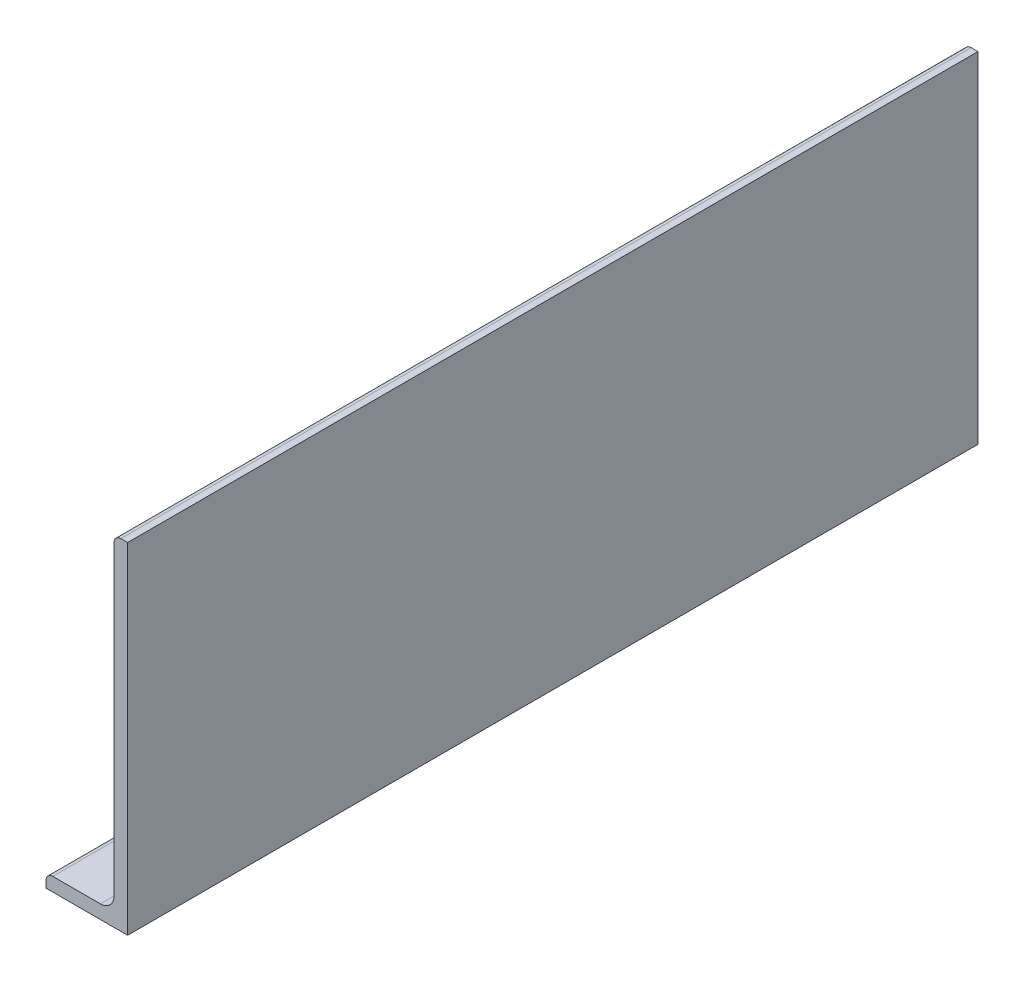
ISO-10303-21;
HEADER;
FILE_DESCRIPTION(('STEP AP214'),'2;1');
FILE_NAME('part.step','',(''),(''),'','','');
FILE_SCHEMA(('AUTOMOTIVE_DESIGN { 1 0 10303 214 1 1 1 1 }'));
ENDSEC;
DATA;
#1=APPLICATION_CONTEXT('core data for automotive mechanical design processes');
#2=APPLICATION_PROTOCOL_DEFINITION('international standard','automotive_design',2000,#1);
#3=PRODUCT_CONTEXT('',#1,'mechanical');
#4=PRODUCT('Part','Part','',(#3));
#5=PRODUCT_RELATED_PRODUCT_CATEGORY('part','',(#4));
#6=PRODUCT_DEFINITION_FORMATION('','',#4);
#7=PRODUCT_DEFINITION_CONTEXT('part definition',#1,'design');
#8=PRODUCT_DEFINITION('design','',#6,#7);
#9=PRODUCT_DEFINITION_SHAPE('','',#8);
#10=(LENGTH_UNIT() NAMED_UNIT(*) SI_UNIT(.MILLI.,.METRE.));
#11=(NAMED_UNIT(*) PLANE_ANGLE_UNIT() SI_UNIT($,.RADIAN.));
#12=(NAMED_UNIT(*) SI_UNIT($,.STERADIAN.) SOLID_ANGLE_UNIT());
#13=UNCERTAINTY_MEASURE_WITH_UNIT(LENGTH_MEASURE(1.E-05),#10,'distance_accuracy_value','');
#14=(GEOMETRIC_REPRESENTATION_CONTEXT(3) GLOBAL_UNCERTAINTY_ASSIGNED_CONTEXT((#13)) GLOBAL_UNIT_ASSIGNED_CONTEXT((#10,
#11,#12)) REPRESENTATION_CONTEXT('',''));
#15=CARTESIAN_POINT('',(0.,0.,0.));
#16=DIRECTION('',(0.,0.,1.));
#17=DIRECTION('',(1.,0.,0.));
#18=AXIS2_PLACEMENT_3D('',#15,#16,#17);
#19=CARTESIAN_POINT('',(324.671950076369,-19.4191739142864,125.));
#20=DIRECTION('',(0.,-1.,0.));
#21=DIRECTION('',(0.,0.,-1.));
#22=AXIS2_PLACEMENT_3D('',#19,#20,#21);
#23=PLANE('',#22);
#24=DIRECTION('',(-1.,0.,0.));
#25=VECTOR('',#24,1.);
#26=CARTESIAN_POINT('',(324.671950076369,-19.4191739142864,0.));
#27=LINE('',#26,#25);
#28=CARTESIAN_POINT('',(326.671950076369,-19.4191739142864,0.));
#29=VERTEX_POINT('',#28);
#30=CARTESIAN_POINT('',(325.671950076369,-19.4191739142864,0.));
#31=VERTEX_POINT('',#30);
#32=EDGE_CURVE('E135',#29,#31,#27,.T.);
#33=ORIENTED_EDGE('',*,*,#32,.T.);
#34=DIRECTION('',(0.,0.,-1.));
#35=VECTOR('',#34,1.);
#36=CARTESIAN_POINT('',(325.671950076369,-19.4191739142864,125.));
#37=LINE('',#36,#35);
#38=CARTESIAN_POINT('',(325.671950076369,-19.4191739142864,125.));
#39=VERTEX_POINT('',#38);
#40=EDGE_CURVE('E167',#31,#39,#37,.F.);
#41=ORIENTED_EDGE('',*,*,#40,.T.);
#42=DIRECTION('',(-1.,0.,0.));
#43=VECTOR('',#42,1.);
#44=CARTESIAN_POINT('',(324.671950076369,-19.4191739142864,125.));
#45=LINE('',#44,#43);
#46=CARTESIAN_POINT('',(326.671950076369,-19.4191739142864,125.));
#47=VERTEX_POINT('',#46);
#48=EDGE_CURVE('E148',#47,#39,#45,.T.);
#49=ORIENTED_EDGE('',*,*,#48,.F.);
#50=DIRECTION('',(0.,0.,-1.));
#51=VECTOR('',#50,1.);
#52=CARTESIAN_POINT('',(326.671950076369,-19.4191739142864,125.));
#53=LINE('',#52,#51);
#54=EDGE_CURVE('E131',#47,#29,#53,.T.);
#55=ORIENTED_EDGE('',*,*,#54,.T.);
#56=EDGE_LOOP('',(#33,#41,#49,#55));
#57=FACE_BOUND('',#56,.T.);
#58=ADVANCED_FACE('F33',(#57),#23,.F.);
#59=CARTESIAN_POINT('',(324.671950076369,-67.4191739142864,125.));
#60=DIRECTION('',(1.,0.,0.));
#61=DIRECTION('',(0.,0.,-1.));
#62=AXIS2_PLACEMENT_3D('',#59,#60,#61);
#63=PLANE('',#62);
#64=DIRECTION('',(0.,-1.,0.));
#65=VECTOR('',#64,1.);
#66=CARTESIAN_POINT('',(324.671950076369,-67.4191739142864,0.));
#67=LINE('',#66,#65);
#68=CARTESIAN_POINT('',(324.671950076369,-20.4191739142864,0.));
#69=VERTEX_POINT('',#68);
#70=CARTESIAN_POINT('',(324.671950076369,-65.4191739142864,0.));
#71=VERTEX_POINT('',#70);
#72=EDGE_CURVE('E138',#69,#71,#67,.T.);
#73=ORIENTED_EDGE('',*,*,#72,.T.);
#74=DIRECTION('',(0.,0.,-1.));
#75=VECTOR('',#74,1.);
#76=CARTESIAN_POINT('',(324.671950076369,-65.4191739142864,125.));
#77=LINE('',#76,#75);
#78=CARTESIAN_POINT('',(324.671950076369,-65.4191739142864,125.));
#79=VERTEX_POINT('',#78);
#80=EDGE_CURVE('E54',#71,#79,#77,.F.);
#81=ORIENTED_EDGE('',*,*,#80,.T.);
#82=DIRECTION('',(0.,-1.,0.));
#83=VECTOR('',#82,1.);
#84=CARTESIAN_POINT('',(324.671950076369,-67.4191739142864,125.));
#85=LINE('',#84,#83);
#86=CARTESIAN_POINT('',(324.671950076369,-20.4191739142864,125.));
#87=VERTEX_POINT('',#86);
#88=EDGE_CURVE('E240',#87,#79,#85,.T.);
#89=ORIENTED_EDGE('',*,*,#88,.F.);
#90=DIRECTION('',(0.,0.,-1.));
#91=VECTOR('',#90,1.);
#92=CARTESIAN_POINT('',(324.671950076369,-20.4191739142864,125.));
#93=LINE('',#92,#91);
#94=EDGE_CURVE('E164',#87,#69,#93,.T.);
#95=ORIENTED_EDGE('',*,*,#94,.T.);
#96=EDGE_LOOP('',(#73,#81,#89,#95));
#97=FACE_BOUND('',#96,.T.);
#98=ADVANCED_FACE('F193',(#97),#63,.F.);
#99=CARTESIAN_POINT('',(314.671950076369,-67.4191739142864,125.));
#100=DIRECTION('',(0.,-1.,0.));
#101=DIRECTION('',(0.,0.,-1.));
#102=AXIS2_PLACEMENT_3D('',#99,#100,#101);
#103=PLANE('',#102);
#104=CARTESIAN_POINT('',(319.171950076369,-67.4191739142864,105.));
#105=DIRECTION('',(0.,1.,0.));
#106=DIRECTION('',(0.,0.,1.));
#107=AXIS2_PLACEMENT_3D('',#104,#105,#106);
#108=CIRCLE('',#107,1.59999999999997);
#109=CARTESIAN_POINT('',(319.171950076369,-67.4191739142864,106.6));
#110=VERTEX_POINT('',#109);
#111=EDGE_CURVE('E228',#110,#110,#108,.T.);
#112=ORIENTED_EDGE('',*,*,#111,.F.);
#113=EDGE_LOOP('',(#112));
#114=FACE_BOUND('',#113,.T.);
#115=CARTESIAN_POINT('',(319.171950076369,-67.4191739142864,20.));
#116=DIRECTION('',(0.,1.,0.));
#117=DIRECTION('',(0.,0.,1.));
#118=AXIS2_PLACEMENT_3D('',#115,#116,#117);
#119=CIRCLE('',#118,1.59999999999996);
#120=CARTESIAN_POINT('',(319.171950076369,-67.4191739142864,21.6));
#121=VERTEX_POINT('',#120);
#122=EDGE_CURVE('E233',#121,#121,#119,.T.);
#123=ORIENTED_EDGE('',*,*,#122,.F.);
#124=EDGE_LOOP('',(#123));
#125=FACE_BOUND('',#124,.T.);
#126=DIRECTION('',(-1.,0.,0.));
#127=VECTOR('',#126,1.);
#128=CARTESIAN_POINT('',(314.671950076369,-67.4191739142864,125.));
#129=LINE('',#128,#127);
#130=CARTESIAN_POINT('',(322.671950076369,-67.4191739142864,125.));
#131=VERTEX_POINT('',#130);
#132=CARTESIAN_POINT('',(315.671950076369,-67.4191739142864,125.));
#133=VERTEX_POINT('',#132);
#134=EDGE_CURVE('E114',#131,#133,#129,.T.);
#135=ORIENTED_EDGE('',*,*,#134,.F.);
#136=DIRECTION('',(0.,0.,-1.));
#137=VECTOR('',#136,1.);
#138=CARTESIAN_POINT('',(322.671950076369,-67.4191739142864,0.));
#139=LINE('',#138,#137);
#140=CARTESIAN_POINT('',(322.671950076369,-67.4191739142864,0.));
#141=VERTEX_POINT('',#140);
#142=EDGE_CURVE('E169',#131,#141,#139,.T.);
#143=ORIENTED_EDGE('',*,*,#142,.T.);
#144=DIRECTION('',(-1.,0.,0.));
#145=VECTOR('',#144,1.);
#146=CARTESIAN_POINT('',(314.671950076369,-67.4191739142864,0.));
#147=LINE('',#146,#145);
#148=CARTESIAN_POINT('',(315.671950076369,-67.4191739142864,0.));
#149=VERTEX_POINT('',#148);
#150=EDGE_CURVE('E141',#141,#149,#147,.T.);
#151=ORIENTED_EDGE('',*,*,#150,.T.);
#152=DIRECTION('',(0.,0.,-1.));
#153=VECTOR('',#152,1.);
#154=CARTESIAN_POINT('',(315.671950076369,-67.4191739142864,125.));
#155=LINE('',#154,#153);
#156=EDGE_CURVE('E158',#149,#133,#155,.F.);
#157=ORIENTED_EDGE('',*,*,#156,.T.);
#158=EDGE_LOOP('',(#135,#143,#151,#157));
#159=FACE_BOUND('',#158,.T.);
#160=ADVANCED_FACE('F175',(#114,#125,#159),#103,.F.);
#161=CARTESIAN_POINT('',(314.671950076369,-69.4191739142864,125.));
#162=DIRECTION('',(1.,0.,0.));
#163=DIRECTION('',(0.,0.,-1.));
#164=AXIS2_PLACEMENT_3D('',#161,#162,#163);
#165=PLANE('',#164);
#166=DIRECTION('',(0.,-1.,0.));
#167=VECTOR('',#166,1.);
#168=CARTESIAN_POINT('',(314.671950076369,-69.4191739142864,125.));
#169=LINE('',#168,#167);
#170=CARTESIAN_POINT('',(314.671950076369,-68.4191739142864,125.));
#171=VERTEX_POINT('',#170);
#172=CARTESIAN_POINT('',(314.671950076369,-69.4191739142864,125.));
#173=VERTEX_POINT('',#172);
#174=EDGE_CURVE('E103',#171,#173,#169,.T.);
#175=ORIENTED_EDGE('',*,*,#174,.F.);
#176=DIRECTION('',(0.,0.,-1.));
#177=VECTOR('',#176,1.);
#178=CARTESIAN_POINT('',(314.671950076369,-68.4191739142864,125.));
#179=LINE('',#178,#177);
#180=CARTESIAN_POINT('',(314.671950076369,-68.4191739142864,0.));
#181=VERTEX_POINT('',#180);
#182=EDGE_CURVE('E123',#171,#181,#179,.T.);
#183=ORIENTED_EDGE('',*,*,#182,.T.);
#184=DIRECTION('',(0.,-1.,0.));
#185=VECTOR('',#184,1.);
#186=CARTESIAN_POINT('',(314.671950076369,-69.4191739142864,0.));
#187=LINE('',#186,#185);
#188=CARTESIAN_POINT('',(314.671950076369,-69.4191739142864,0.));
#189=VERTEX_POINT('',#188);
#190=EDGE_CURVE('E120',#181,#189,#187,.T.);
#191=ORIENTED_EDGE('',*,*,#190,.T.);
#192=DIRECTION('',(0.,0.,-1.));
#193=VECTOR('',#192,1.);
#194=CARTESIAN_POINT('',(314.671950076369,-69.4191739142864,125.));
#195=LINE('',#194,#193);
#196=EDGE_CURVE('E117',#173,#189,#195,.T.);
#197=ORIENTED_EDGE('',*,*,#196,.F.);
#198=EDGE_LOOP('',(#175,#183,#191,#197));
#199=FACE_BOUND('',#198,.T.);
#200=ADVANCED_FACE('F118',(#199),#165,.F.);
#201=CARTESIAN_POINT('',(326.671950076369,-69.4191739142864,125.));
#202=DIRECTION('',(0.,1.,0.));
#203=DIRECTION('',(0.,0.,1.));
#204=AXIS2_PLACEMENT_3D('',#201,#202,#203);
#205=PLANE('',#204);
#206=CARTESIAN_POINT('',(319.171950076369,-69.4191739142864,105.));
#207=DIRECTION('',(0.,1.,0.));
#208=DIRECTION('',(0.,0.,1.));
#209=AXIS2_PLACEMENT_3D('',#206,#207,#208);
#210=CIRCLE('',#209,1.59999999999997);
#211=CARTESIAN_POINT('',(319.171950076369,-69.4191739142864,106.6));
#212=VERTEX_POINT('',#211);
#213=EDGE_CURVE('E139',#212,#212,#210,.T.);
#214=ORIENTED_EDGE('',*,*,#213,.T.);
#215=EDGE_LOOP('',(#214));
#216=FACE_BOUND('',#215,.T.);
#217=CARTESIAN_POINT('',(319.171950076369,-69.4191739142864,20.));
#218=DIRECTION('',(0.,1.,0.));
#219=DIRECTION('',(0.,0.,1.));
#220=AXIS2_PLACEMENT_3D('',#217,#218,#219);
#221=CIRCLE('',#220,1.59999999999996);
#222=CARTESIAN_POINT('',(319.171950076369,-69.4191739142864,21.6));
#223=VERTEX_POINT('',#222);
#224=EDGE_CURVE('E229',#223,#223,#221,.T.);
#225=ORIENTED_EDGE('',*,*,#224,.T.);
#226=EDGE_LOOP('',(#225));
#227=FACE_BOUND('',#226,.T.);
#228=DIRECTION('',(1.,0.,0.));
#229=VECTOR('',#228,1.);
#230=CARTESIAN_POINT('',(326.671950076369,-69.4191739142864,0.));
#231=LINE('',#230,#229);
#232=CARTESIAN_POINT('',(326.671950076369,-69.4191739142864,0.));
#233=VERTEX_POINT('',#232);
#234=EDGE_CURVE('E144',#189,#233,#231,.T.);
#235=ORIENTED_EDGE('',*,*,#234,.T.);
#236=DIRECTION('',(0.,0.,-1.));
#237=VECTOR('',#236,1.);
#238=CARTESIAN_POINT('',(326.671950076369,-69.4191739142864,125.));
#239=LINE('',#238,#237);
#240=CARTESIAN_POINT('',(326.671950076369,-69.4191739142864,125.));
#241=VERTEX_POINT('',#240);
#242=EDGE_CURVE('E124',#241,#233,#239,.T.);
#243=ORIENTED_EDGE('',*,*,#242,.F.);
#244=DIRECTION('',(1.,0.,0.));
#245=VECTOR('',#244,1.);
#246=CARTESIAN_POINT('',(326.671950076369,-69.4191739142864,125.));
#247=LINE('',#246,#245);
#248=EDGE_CURVE('E107',#173,#241,#247,.T.);
#249=ORIENTED_EDGE('',*,*,#248,.F.);
#250=ORIENTED_EDGE('',*,*,#196,.T.);
#251=EDGE_LOOP('',(#235,#243,#249,#250));
#252=FACE_BOUND('',#251,.T.);
#253=ADVANCED_FACE('F126',(#216,#227,#252),#205,.F.);
#254=CARTESIAN_POINT('',(326.671950076369,-19.4191739142864,125.));
#255=DIRECTION('',(-1.,0.,0.));
#256=DIRECTION('',(0.,0.,1.));
#257=AXIS2_PLACEMENT_3D('',#254,#255,#256);
#258=PLANE('',#257);
#259=DIRECTION('',(0.,1.,0.));
#260=VECTOR('',#259,1.);
#261=CARTESIAN_POINT('',(326.671950076369,-19.4191739142864,0.));
#262=LINE('',#261,#260);
#263=EDGE_CURVE('E146',#233,#29,#262,.T.);
#264=ORIENTED_EDGE('',*,*,#263,.T.);
#265=ORIENTED_EDGE('',*,*,#54,.F.);
#266=DIRECTION('',(0.,1.,0.));
#267=VECTOR('',#266,1.);
#268=CARTESIAN_POINT('',(326.671950076369,-19.4191739142864,125.));
#269=LINE('',#268,#267);
#270=EDGE_CURVE('E129',#241,#47,#269,.T.);
#271=ORIENTED_EDGE('',*,*,#270,.F.);
#272=ORIENTED_EDGE('',*,*,#242,.T.);
#273=EDGE_LOOP('',(#264,#265,#271,#272));
#274=FACE_BOUND('',#273,.T.);
#275=ADVANCED_FACE('F207',(#274),#258,.F.);
#276=CARTESIAN_POINT('',(0.,0.,125.));
#277=DIRECTION('',(0.,0.,-1.));
#278=DIRECTION('',(-1.,0.,0.));
#279=AXIS2_PLACEMENT_3D('',#276,#277,#278);
#280=PLANE('',#279);
#281=ORIENTED_EDGE('',*,*,#88,.T.);
#282=CARTESIAN_POINT('',(322.671950076369,-65.4191739142864,125.));
#283=DIRECTION('',(0.,0.,-1.));
#284=DIRECTION('',(-1.,0.,0.));
#285=AXIS2_PLACEMENT_3D('',#282,#283,#284);
#286=CIRCLE('',#285,2.);
#287=EDGE_CURVE('E11',#79,#131,#286,.T.);
#288=ORIENTED_EDGE('',*,*,#287,.T.);
#289=ORIENTED_EDGE('',*,*,#134,.T.);
#290=CARTESIAN_POINT('',(315.671950076369,-68.4191739142864,125.));
#291=DIRECTION('',(0.,0.,-1.));
#292=DIRECTION('',(-1.,0.,0.));
#293=AXIS2_PLACEMENT_3D('',#290,#291,#292);
#294=CIRCLE('',#293,1.);
#295=EDGE_CURVE('E110',#133,#171,#294,.F.);
#296=ORIENTED_EDGE('',*,*,#295,.T.);
#297=ORIENTED_EDGE('',*,*,#174,.T.);
#298=ORIENTED_EDGE('',*,*,#248,.T.);
#299=ORIENTED_EDGE('',*,*,#270,.T.);
#300=ORIENTED_EDGE('',*,*,#48,.T.);
#301=CARTESIAN_POINT('',(325.671950076369,-20.4191739142864,125.));
#302=DIRECTION('',(0.,0.,-1.));
#303=DIRECTION('',(-1.,0.,0.));
#304=AXIS2_PLACEMENT_3D('',#301,#302,#303);
#305=CIRCLE('',#304,1.);
#306=EDGE_CURVE('E161',#39,#87,#305,.F.);
#307=ORIENTED_EDGE('',*,*,#306,.T.);
#308=EDGE_LOOP('',(#281,#288,#289,#296,#297,#298,#299,#300,#307));
#309=FACE_BOUND('',#308,.T.);
#310=ADVANCED_FACE('F105',(#309),#280,.F.);
#311=CARTESIAN_POINT('',(0.,0.,0.));
#312=DIRECTION('',(0.,0.,-1.));
#313=DIRECTION('',(-1.,0.,0.));
#314=AXIS2_PLACEMENT_3D('',#311,#312,#313);
#315=PLANE('',#314);
#316=ORIENTED_EDGE('',*,*,#190,.F.);
#317=CARTESIAN_POINT('',(315.671950076369,-68.4191739142864,0.));
#318=DIRECTION('',(0.,0.,-1.));
#319=DIRECTION('',(-1.,0.,0.));
#320=AXIS2_PLACEMENT_3D('',#317,#318,#319);
#321=CIRCLE('',#320,1.);
#322=EDGE_CURVE('E155',#181,#149,#321,.T.);
#323=ORIENTED_EDGE('',*,*,#322,.T.);
#324=ORIENTED_EDGE('',*,*,#150,.F.);
#325=CARTESIAN_POINT('',(322.671950076369,-65.4191739142864,0.));
#326=DIRECTION('',(0.,0.,-1.));
#327=DIRECTION('',(-1.,0.,0.));
#328=AXIS2_PLACEMENT_3D('',#325,#326,#327);
#329=CIRCLE('',#328,2.);
#330=EDGE_CURVE('E41',#141,#71,#329,.F.);
#331=ORIENTED_EDGE('',*,*,#330,.T.);
#332=ORIENTED_EDGE('',*,*,#72,.F.);
#333=CARTESIAN_POINT('',(325.671950076369,-20.4191739142864,0.));
#334=DIRECTION('',(0.,0.,-1.));
#335=DIRECTION('',(-1.,0.,0.));
#336=AXIS2_PLACEMENT_3D('',#333,#334,#335);
#337=CIRCLE('',#336,1.);
#338=EDGE_CURVE('E153',#69,#31,#337,.T.);
#339=ORIENTED_EDGE('',*,*,#338,.T.);
#340=ORIENTED_EDGE('',*,*,#32,.F.);
#341=ORIENTED_EDGE('',*,*,#263,.F.);
#342=ORIENTED_EDGE('',*,*,#234,.F.);
#343=EDGE_LOOP('',(#316,#323,#324,#331,#332,#339,#340,#341,#342));
#344=FACE_BOUND('',#343,.T.);
#345=ADVANCED_FACE('F178',(#344),#315,.T.);
#346=CARTESIAN_POINT('',(315.671950076369,-68.4191739142864,125.));
#347=DIRECTION('',(0.,0.,-1.));
#348=DIRECTION('',(-1.,0.,0.));
#349=AXIS2_PLACEMENT_3D('',#346,#347,#348);
#350=CYLINDRICAL_SURFACE('',#349,1.);
#351=ORIENTED_EDGE('',*,*,#295,.F.);
#352=ORIENTED_EDGE('',*,*,#156,.F.);
#353=ORIENTED_EDGE('',*,*,#322,.F.);
#354=ORIENTED_EDGE('',*,*,#182,.F.);
#355=EDGE_LOOP('',(#351,#352,#353,#354));
#356=FACE_BOUND('',#355,.T.);
#357=ADVANCED_FACE('F181',(#356),#350,.T.);
#358=CARTESIAN_POINT('',(325.671950076369,-20.4191739142864,125.));
#359=DIRECTION('',(0.,0.,-1.));
#360=DIRECTION('',(-1.,0.,0.));
#361=AXIS2_PLACEMENT_3D('',#358,#359,#360);
#362=CYLINDRICAL_SURFACE('',#361,1.);
#363=ORIENTED_EDGE('',*,*,#306,.F.);
#364=ORIENTED_EDGE('',*,*,#40,.F.);
#365=ORIENTED_EDGE('',*,*,#338,.F.);
#366=ORIENTED_EDGE('',*,*,#94,.F.);
#367=EDGE_LOOP('',(#363,#364,#365,#366));
#368=FACE_BOUND('',#367,.T.);
#369=ADVANCED_FACE('F183',(#368),#362,.T.);
#370=CARTESIAN_POINT('',(322.671950076369,-65.4191739142864,125.));
#371=DIRECTION('',(0.,0.,1.));
#372=DIRECTION('',(1.,0.,0.));
#373=AXIS2_PLACEMENT_3D('',#370,#371,#372);
#374=CYLINDRICAL_SURFACE('',#373,2.);
#375=ORIENTED_EDGE('',*,*,#287,.F.);
#376=ORIENTED_EDGE('',*,*,#80,.F.);
#377=ORIENTED_EDGE('',*,*,#330,.F.);
#378=ORIENTED_EDGE('',*,*,#142,.F.);
#379=EDGE_LOOP('',(#375,#376,#377,#378));
#380=FACE_BOUND('',#379,.T.);
#381=ADVANCED_FACE('F35',(#380),#374,.F.);
#382=CARTESIAN_POINT('',(319.171950076369,-69.4191739142864,20.));
#383=DIRECTION('',(0.,1.,0.));
#384=DIRECTION('',(0.,0.,1.));
#385=AXIS2_PLACEMENT_3D('',#382,#383,#384);
#386=CYLINDRICAL_SURFACE('',#385,1.59999999999996);
#387=ORIENTED_EDGE('',*,*,#224,.F.);
#388=EDGE_LOOP('',(#387));
#389=FACE_BOUND('',#388,.T.);
#390=ORIENTED_EDGE('',*,*,#122,.T.);
#391=EDGE_LOOP('',(#390));
#392=FACE_BOUND('',#391,.T.);
#393=ADVANCED_FACE('F214',(#389,#392),#386,.F.);
#394=CARTESIAN_POINT('',(319.171950076369,-69.4191739142864,105.));
#395=DIRECTION('',(0.,1.,0.));
#396=DIRECTION('',(0.,0.,1.));
#397=AXIS2_PLACEMENT_3D('',#394,#395,#396);
#398=CYLINDRICAL_SURFACE('',#397,1.59999999999997);
#399=ORIENTED_EDGE('',*,*,#213,.F.);
#400=EDGE_LOOP('',(#399));
#401=FACE_BOUND('',#400,.T.);
#402=ORIENTED_EDGE('',*,*,#111,.T.);
#403=EDGE_LOOP('',(#402));
#404=FACE_BOUND('',#403,.T.);
#405=ADVANCED_FACE('F217',(#401,#404),#398,.F.);
#406=CLOSED_SHELL('',(#58,#98,#160,#200,#253,#275,#310,#345,#357,#369,#381,#393,#405));
#407=MANIFOLD_SOLID_BREP('B2',#406);
#408=ADVANCED_BREP_SHAPE_REPRESENTATION('',(#18,#407),#14);
#409=SHAPE_DEFINITION_REPRESENTATION(#9,#408);
ENDSEC;
END-ISO-10303-21;
